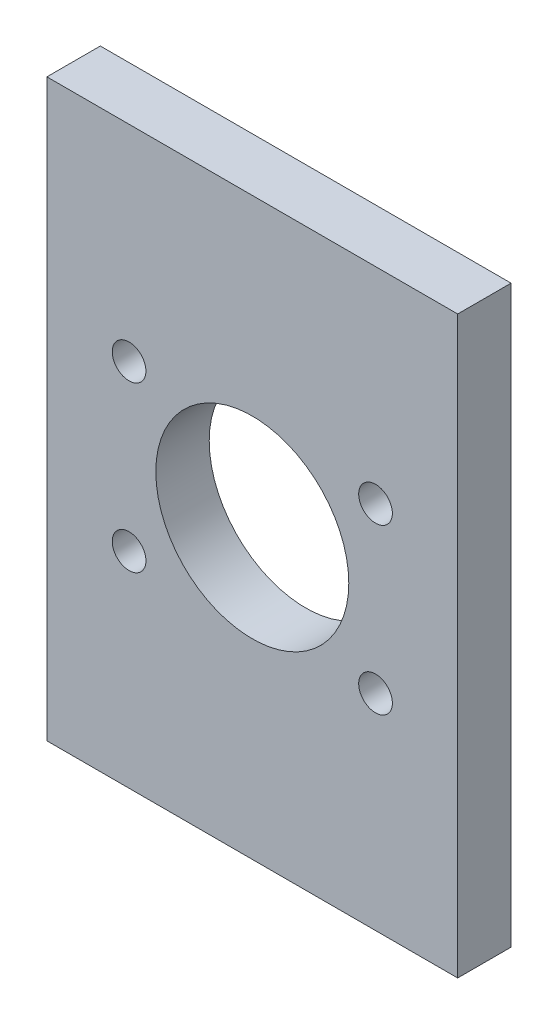
ISO-10303-21;
HEADER;
FILE_DESCRIPTION(('STEP AP214'),'2;1');
FILE_NAME('part.step','',(''),(''),'','','');
FILE_SCHEMA(('AUTOMOTIVE_DESIGN { 1 0 10303 214 1 1 1 1 }'));
ENDSEC;
DATA;
#1=APPLICATION_CONTEXT('core data for automotive mechanical design processes');
#2=APPLICATION_PROTOCOL_DEFINITION('international standard','automotive_design',2000,#1);
#3=PRODUCT_CONTEXT('',#1,'mechanical');
#4=PRODUCT('Part','Part','',(#3));
#5=PRODUCT_RELATED_PRODUCT_CATEGORY('part','',(#4));
#6=PRODUCT_DEFINITION_FORMATION('','',#4);
#7=PRODUCT_DEFINITION_CONTEXT('part definition',#1,'design');
#8=PRODUCT_DEFINITION('design','',#6,#7);
#9=PRODUCT_DEFINITION_SHAPE('','',#8);
#10=(LENGTH_UNIT() NAMED_UNIT(*) SI_UNIT(.MILLI.,.METRE.));
#11=(NAMED_UNIT(*) PLANE_ANGLE_UNIT() SI_UNIT($,.RADIAN.));
#12=(NAMED_UNIT(*) SI_UNIT($,.STERADIAN.) SOLID_ANGLE_UNIT());
#13=UNCERTAINTY_MEASURE_WITH_UNIT(LENGTH_MEASURE(1.E-05),#10,'distance_accuracy_value','');
#14=(GEOMETRIC_REPRESENTATION_CONTEXT(3) GLOBAL_UNCERTAINTY_ASSIGNED_CONTEXT((#13)) GLOBAL_UNIT_ASSIGNED_CONTEXT((#10,
#11,#12)) REPRESENTATION_CONTEXT('',''));
#15=CARTESIAN_POINT('',(0.,0.,0.));
#16=DIRECTION('',(0.,0.,1.));
#17=DIRECTION('',(1.,0.,0.));
#18=AXIS2_PLACEMENT_3D('',#15,#16,#17);
#19=CARTESIAN_POINT('',(0.,0.,13.));
#20=DIRECTION('',(0.,0.,1.));
#21=DIRECTION('',(1.,0.,0.));
#22=AXIS2_PLACEMENT_3D('',#19,#20,#21);
#23=PLANE('',#22);
#24=CARTESIAN_POINT('',(-30.,20.,13.));
#25=DIRECTION('',(0.,0.,1.));
#26=DIRECTION('',(1.,0.,0.));
#27=AXIS2_PLACEMENT_3D('',#24,#25,#26);
#28=CIRCLE('',#27,4.09999999999999);
#29=CARTESIAN_POINT('',(-25.9,20.,13.));
#30=VERTEX_POINT('',#29);
#31=EDGE_CURVE('E266',#30,#30,#28,.T.);
#32=ORIENTED_EDGE('',*,*,#31,.F.);
#33=EDGE_LOOP('',(#32));
#34=FACE_BOUND('',#33,.T.);
#35=CARTESIAN_POINT('',(30.,20.,13.));
#36=DIRECTION('',(0.,0.,1.));
#37=DIRECTION('',(1.,0.,0.));
#38=AXIS2_PLACEMENT_3D('',#35,#36,#37);
#39=CIRCLE('',#38,4.09999999999999);
#40=CARTESIAN_POINT('',(34.1,20.,13.));
#41=VERTEX_POINT('',#40);
#42=EDGE_CURVE('E124',#41,#41,#39,.T.);
#43=ORIENTED_EDGE('',*,*,#42,.F.);
#44=EDGE_LOOP('',(#43));
#45=FACE_BOUND('',#44,.T.);
#46=CARTESIAN_POINT('',(30.,-20.,13.));
#47=DIRECTION('',(0.,0.,1.));
#48=DIRECTION('',(1.,0.,0.));
#49=AXIS2_PLACEMENT_3D('',#46,#47,#48);
#50=CIRCLE('',#49,4.09999999999999);
#51=CARTESIAN_POINT('',(34.1,-20.,13.));
#52=VERTEX_POINT('',#51);
#53=EDGE_CURVE('E113',#52,#52,#50,.T.);
#54=ORIENTED_EDGE('',*,*,#53,.F.);
#55=EDGE_LOOP('',(#54));
#56=FACE_BOUND('',#55,.T.);
#57=CARTESIAN_POINT('',(-30.,-20.,13.));
#58=DIRECTION('',(0.,0.,1.));
#59=DIRECTION('',(1.,0.,0.));
#60=AXIS2_PLACEMENT_3D('',#57,#58,#59);
#61=CIRCLE('',#60,4.09999999999999);
#62=CARTESIAN_POINT('',(-25.9,-20.,13.));
#63=VERTEX_POINT('',#62);
#64=EDGE_CURVE('E112',#63,#63,#61,.T.);
#65=ORIENTED_EDGE('',*,*,#64,.F.);
#66=EDGE_LOOP('',(#65));
#67=FACE_BOUND('',#66,.T.);
#68=DIRECTION('',(0.,1.,0.));
#69=VECTOR('',#68,1.);
#70=CARTESIAN_POINT('',(50.,70.,13.));
#71=LINE('',#70,#69);
#72=CARTESIAN_POINT('',(50.,-70.,13.));
#73=VERTEX_POINT('',#72);
#74=CARTESIAN_POINT('',(50.,70.,13.));
#75=VERTEX_POINT('',#74);
#76=EDGE_CURVE('E89',#73,#75,#71,.T.);
#77=ORIENTED_EDGE('',*,*,#76,.T.);
#78=DIRECTION('',(-1.,0.,0.));
#79=VECTOR('',#78,1.);
#80=CARTESIAN_POINT('',(-50.,70.,13.));
#81=LINE('',#80,#79);
#82=CARTESIAN_POINT('',(-50.,70.,13.));
#83=VERTEX_POINT('',#82);
#84=EDGE_CURVE('E84',#75,#83,#81,.T.);
#85=ORIENTED_EDGE('',*,*,#84,.T.);
#86=DIRECTION('',(0.,-1.,0.));
#87=VECTOR('',#86,1.);
#88=CARTESIAN_POINT('',(-50.,70.,13.));
#89=LINE('',#88,#87);
#90=CARTESIAN_POINT('',(-50.,-70.,13.));
#91=VERTEX_POINT('',#90);
#92=EDGE_CURVE('E87',#83,#91,#89,.T.);
#93=ORIENTED_EDGE('',*,*,#92,.T.);
#94=DIRECTION('',(1.,0.,0.));
#95=VECTOR('',#94,1.);
#96=CARTESIAN_POINT('',(-50.,-70.,13.));
#97=LINE('',#96,#95);
#98=EDGE_CURVE('E54',#91,#73,#97,.T.);
#99=ORIENTED_EDGE('',*,*,#98,.T.);
#100=EDGE_LOOP('',(#77,#85,#93,#99));
#101=FACE_BOUND('',#100,.T.);
#102=CARTESIAN_POINT('',(0.,0.,13.));
#103=DIRECTION('',(0.,0.,1.));
#104=DIRECTION('',(1.,0.,0.));
#105=AXIS2_PLACEMENT_3D('',#102,#103,#104);
#106=CIRCLE('',#105,23.49);
#107=CARTESIAN_POINT('',(-23.49,0.,13.));
#108=VERTEX_POINT('',#107);
#109=EDGE_CURVE('E105',#108,#108,#106,.T.);
#110=ORIENTED_EDGE('',*,*,#109,.F.);
#111=EDGE_LOOP('',(#110));
#112=FACE_BOUND('',#111,.T.);
#113=ADVANCED_FACE('F35',(#34,#45,#56,#67,#101,#112),#23,.T.);
#114=CARTESIAN_POINT('',(0.,0.,0.));
#115=DIRECTION('',(0.,0.,1.));
#116=DIRECTION('',(1.,0.,0.));
#117=AXIS2_PLACEMENT_3D('',#114,#115,#116);
#118=PLANE('',#117);
#119=CARTESIAN_POINT('',(-30.,20.,0.));
#120=DIRECTION('',(0.,0.,1.));
#121=DIRECTION('',(1.,0.,0.));
#122=AXIS2_PLACEMENT_3D('',#119,#120,#121);
#123=CIRCLE('',#122,4.09999999999999);
#124=CARTESIAN_POINT('',(-25.9,20.,0.));
#125=VERTEX_POINT('',#124);
#126=EDGE_CURVE('E264',#125,#125,#123,.T.);
#127=ORIENTED_EDGE('',*,*,#126,.T.);
#128=EDGE_LOOP('',(#127));
#129=FACE_BOUND('',#128,.T.);
#130=CARTESIAN_POINT('',(30.,20.,0.));
#131=DIRECTION('',(0.,0.,1.));
#132=DIRECTION('',(1.,0.,0.));
#133=AXIS2_PLACEMENT_3D('',#130,#131,#132);
#134=CIRCLE('',#133,4.09999999999999);
#135=CARTESIAN_POINT('',(34.1,20.,0.));
#136=VERTEX_POINT('',#135);
#137=EDGE_CURVE('E39',#136,#136,#134,.T.);
#138=ORIENTED_EDGE('',*,*,#137,.T.);
#139=EDGE_LOOP('',(#138));
#140=FACE_BOUND('',#139,.T.);
#141=CARTESIAN_POINT('',(30.,-20.,0.));
#142=DIRECTION('',(0.,0.,1.));
#143=DIRECTION('',(1.,0.,0.));
#144=AXIS2_PLACEMENT_3D('',#141,#142,#143);
#145=CIRCLE('',#144,4.09999999999999);
#146=CARTESIAN_POINT('',(34.1,-20.,0.));
#147=VERTEX_POINT('',#146);
#148=EDGE_CURVE('E110',#147,#147,#145,.T.);
#149=ORIENTED_EDGE('',*,*,#148,.T.);
#150=EDGE_LOOP('',(#149));
#151=FACE_BOUND('',#150,.T.);
#152=CARTESIAN_POINT('',(-30.,-20.,0.));
#153=DIRECTION('',(0.,0.,1.));
#154=DIRECTION('',(1.,0.,0.));
#155=AXIS2_PLACEMENT_3D('',#152,#153,#154);
#156=CIRCLE('',#155,4.09999999999999);
#157=CARTESIAN_POINT('',(-25.9,-20.,0.));
#158=VERTEX_POINT('',#157);
#159=EDGE_CURVE('E117',#158,#158,#156,.T.);
#160=ORIENTED_EDGE('',*,*,#159,.T.);
#161=EDGE_LOOP('',(#160));
#162=FACE_BOUND('',#161,.T.);
#163=DIRECTION('',(0.,1.,0.));
#164=VECTOR('',#163,1.);
#165=CARTESIAN_POINT('',(50.,70.,0.));
#166=LINE('',#165,#164);
#167=CARTESIAN_POINT('',(50.,-70.,0.));
#168=VERTEX_POINT('',#167);
#169=CARTESIAN_POINT('',(50.,70.,0.));
#170=VERTEX_POINT('',#169);
#171=EDGE_CURVE('E102',#168,#170,#166,.T.);
#172=ORIENTED_EDGE('',*,*,#171,.F.);
#173=DIRECTION('',(1.,0.,0.));
#174=VECTOR('',#173,1.);
#175=CARTESIAN_POINT('',(-50.,-70.,0.));
#176=LINE('',#175,#174);
#177=CARTESIAN_POINT('',(-50.,-70.,0.));
#178=VERTEX_POINT('',#177);
#179=EDGE_CURVE('E77',#178,#168,#176,.T.);
#180=ORIENTED_EDGE('',*,*,#179,.F.);
#181=DIRECTION('',(0.,-1.,0.));
#182=VECTOR('',#181,1.);
#183=CARTESIAN_POINT('',(-50.,70.,0.));
#184=LINE('',#183,#182);
#185=CARTESIAN_POINT('',(-50.,70.,0.));
#186=VERTEX_POINT('',#185);
#187=EDGE_CURVE('E71',#186,#178,#184,.T.);
#188=ORIENTED_EDGE('',*,*,#187,.F.);
#189=DIRECTION('',(-1.,0.,0.));
#190=VECTOR('',#189,1.);
#191=CARTESIAN_POINT('',(-50.,70.,0.));
#192=LINE('',#191,#190);
#193=EDGE_CURVE('E93',#170,#186,#192,.T.);
#194=ORIENTED_EDGE('',*,*,#193,.F.);
#195=EDGE_LOOP('',(#172,#180,#188,#194));
#196=FACE_BOUND('',#195,.T.);
#197=CARTESIAN_POINT('',(0.,0.,0.));
#198=DIRECTION('',(0.,0.,1.));
#199=DIRECTION('',(1.,0.,0.));
#200=AXIS2_PLACEMENT_3D('',#197,#198,#199);
#201=CIRCLE('',#200,23.49);
#202=CARTESIAN_POINT('',(-23.49,0.,0.));
#203=VERTEX_POINT('',#202);
#204=EDGE_CURVE('E130',#203,#203,#201,.T.);
#205=ORIENTED_EDGE('',*,*,#204,.T.);
#206=EDGE_LOOP('',(#205));
#207=FACE_BOUND('',#206,.T.);
#208=ADVANCED_FACE('F140',(#129,#140,#151,#162,#196,#207),#118,.F.);
#209=CARTESIAN_POINT('',(50.,70.,13.));
#210=DIRECTION('',(-1.,0.,0.));
#211=DIRECTION('',(0.,-1.,0.));
#212=AXIS2_PLACEMENT_3D('',#209,#210,#211);
#213=PLANE('',#212);
#214=ORIENTED_EDGE('',*,*,#171,.T.);
#215=DIRECTION('',(0.,0.,-1.));
#216=VECTOR('',#215,1.);
#217=CARTESIAN_POINT('',(50.,70.,13.));
#218=LINE('',#217,#216);
#219=EDGE_CURVE('E11',#75,#170,#218,.T.);
#220=ORIENTED_EDGE('',*,*,#219,.F.);
#221=ORIENTED_EDGE('',*,*,#76,.F.);
#222=DIRECTION('',(0.,0.,-1.));
#223=VECTOR('',#222,1.);
#224=CARTESIAN_POINT('',(50.,-70.,13.));
#225=LINE('',#224,#223);
#226=EDGE_CURVE('E98',#73,#168,#225,.T.);
#227=ORIENTED_EDGE('',*,*,#226,.T.);
#228=EDGE_LOOP('',(#214,#220,#221,#227));
#229=FACE_BOUND('',#228,.T.);
#230=ADVANCED_FACE('F37',(#229),#213,.F.);
#231=CARTESIAN_POINT('',(-50.,70.,13.));
#232=DIRECTION('',(0.,-1.,0.));
#233=DIRECTION('',(0.,0.,-1.));
#234=AXIS2_PLACEMENT_3D('',#231,#232,#233);
#235=PLANE('',#234);
#236=ORIENTED_EDGE('',*,*,#193,.T.);
#237=DIRECTION('',(0.,0.,-1.));
#238=VECTOR('',#237,1.);
#239=CARTESIAN_POINT('',(-50.,70.,13.));
#240=LINE('',#239,#238);
#241=EDGE_CURVE('E45',#83,#186,#240,.T.);
#242=ORIENTED_EDGE('',*,*,#241,.F.);
#243=ORIENTED_EDGE('',*,*,#84,.F.);
#244=ORIENTED_EDGE('',*,*,#219,.T.);
#245=EDGE_LOOP('',(#236,#242,#243,#244));
#246=FACE_BOUND('',#245,.T.);
#247=ADVANCED_FACE('F92',(#246),#235,.F.);
#248=CARTESIAN_POINT('',(-50.,70.,13.));
#249=DIRECTION('',(1.,0.,0.));
#250=DIRECTION('',(0.,1.,0.));
#251=AXIS2_PLACEMENT_3D('',#248,#249,#250);
#252=PLANE('',#251);
#253=ORIENTED_EDGE('',*,*,#187,.T.);
#254=DIRECTION('',(0.,0.,-1.));
#255=VECTOR('',#254,1.);
#256=CARTESIAN_POINT('',(-50.,-70.,13.));
#257=LINE('',#256,#255);
#258=EDGE_CURVE('E94',#91,#178,#257,.T.);
#259=ORIENTED_EDGE('',*,*,#258,.F.);
#260=ORIENTED_EDGE('',*,*,#92,.F.);
#261=ORIENTED_EDGE('',*,*,#241,.T.);
#262=EDGE_LOOP('',(#253,#259,#260,#261));
#263=FACE_BOUND('',#262,.T.);
#264=ADVANCED_FACE('F96',(#263),#252,.F.);
#265=CARTESIAN_POINT('',(-50.,-70.,13.));
#266=DIRECTION('',(0.,1.,0.));
#267=DIRECTION('',(0.,0.,1.));
#268=AXIS2_PLACEMENT_3D('',#265,#266,#267);
#269=PLANE('',#268);
#270=ORIENTED_EDGE('',*,*,#179,.T.);
#271=ORIENTED_EDGE('',*,*,#226,.F.);
#272=ORIENTED_EDGE('',*,*,#98,.F.);
#273=ORIENTED_EDGE('',*,*,#258,.T.);
#274=EDGE_LOOP('',(#270,#271,#272,#273));
#275=FACE_BOUND('',#274,.T.);
#276=ADVANCED_FACE('F145',(#275),#269,.F.);
#277=CARTESIAN_POINT('',(0.,0.,13.));
#278=DIRECTION('',(0.,0.,-1.));
#279=DIRECTION('',(-1.,0.,0.));
#280=AXIS2_PLACEMENT_3D('',#277,#278,#279);
#281=CYLINDRICAL_SURFACE('',#280,23.49);
#282=CARTESIAN_POINT('',(-23.49,0.,13.));
#283=CARTESIAN_POINT('',(-23.49,0.,12.8645833333333));
#284=CARTESIAN_POINT('',(-23.49,0.,12.7291666666667));
#285=CARTESIAN_POINT('',(-23.49,0.,12.4583333333333));
#286=CARTESIAN_POINT('',(-23.49,0.,12.3229166666667));
#287=CARTESIAN_POINT('',(-23.49,0.,12.0520833333333));
#288=CARTESIAN_POINT('',(-23.49,0.,11.9166666666667));
#289=CARTESIAN_POINT('',(-23.49,0.,11.6458333333333));
#290=CARTESIAN_POINT('',(-23.49,0.,11.5104166666667));
#291=CARTESIAN_POINT('',(-23.49,0.,11.2395833333333));
#292=CARTESIAN_POINT('',(-23.49,0.,11.1041666666667));
#293=CARTESIAN_POINT('',(-23.49,0.,10.8333333333333));
#294=CARTESIAN_POINT('',(-23.49,0.,10.6979166666667));
#295=CARTESIAN_POINT('',(-23.49,0.,10.4270833333333));
#296=CARTESIAN_POINT('',(-23.49,0.,10.2916666666667));
#297=CARTESIAN_POINT('',(-23.49,0.,10.0208333333333));
#298=CARTESIAN_POINT('',(-23.49,0.,9.88541666666667));
#299=CARTESIAN_POINT('',(-23.49,0.,9.61458333333333));
#300=CARTESIAN_POINT('',(-23.49,0.,9.47916666666667));
#301=CARTESIAN_POINT('',(-23.49,0.,9.20833333333333));
#302=CARTESIAN_POINT('',(-23.49,0.,9.07291666666666));
#303=CARTESIAN_POINT('',(-23.49,0.,8.80208333333333));
#304=CARTESIAN_POINT('',(-23.49,0.,8.66666666666667));
#305=CARTESIAN_POINT('',(-23.49,0.,8.39583333333333));
#306=CARTESIAN_POINT('',(-23.49,0.,8.26041666666667));
#307=CARTESIAN_POINT('',(-23.49,0.,7.98958333333333));
#308=CARTESIAN_POINT('',(-23.49,0.,7.85416666666667));
#309=CARTESIAN_POINT('',(-23.49,0.,7.58333333333333));
#310=CARTESIAN_POINT('',(-23.49,0.,7.44791666666667));
#311=CARTESIAN_POINT('',(-23.49,0.,7.17708333333333));
#312=CARTESIAN_POINT('',(-23.49,0.,7.04166666666667));
#313=CARTESIAN_POINT('',(-23.49,0.,6.77083333333333));
#314=CARTESIAN_POINT('',(-23.49,0.,6.63541666666667));
#315=CARTESIAN_POINT('',(-23.49,0.,6.36458333333333));
#316=CARTESIAN_POINT('',(-23.49,0.,6.22916666666667));
#317=CARTESIAN_POINT('',(-23.49,0.,5.95833333333333));
#318=CARTESIAN_POINT('',(-23.49,0.,5.82291666666667));
#319=CARTESIAN_POINT('',(-23.49,0.,5.55208333333333));
#320=CARTESIAN_POINT('',(-23.49,0.,5.41666666666667));
#321=CARTESIAN_POINT('',(-23.49,0.,5.14583333333333));
#322=CARTESIAN_POINT('',(-23.49,0.,5.01041666666667));
#323=CARTESIAN_POINT('',(-23.49,0.,4.73958333333333));
#324=CARTESIAN_POINT('',(-23.49,0.,4.60416666666667));
#325=CARTESIAN_POINT('',(-23.49,0.,4.33333333333333));
#326=CARTESIAN_POINT('',(-23.49,0.,4.19791666666667));
#327=CARTESIAN_POINT('',(-23.49,0.,3.92708333333333));
#328=CARTESIAN_POINT('',(-23.49,0.,3.79166666666667));
#329=CARTESIAN_POINT('',(-23.49,0.,3.52083333333333));
#330=CARTESIAN_POINT('',(-23.49,0.,3.38541666666667));
#331=CARTESIAN_POINT('',(-23.49,0.,3.11458333333333));
#332=CARTESIAN_POINT('',(-23.49,0.,2.97916666666667));
#333=CARTESIAN_POINT('',(-23.49,0.,2.70833333333333));
#334=CARTESIAN_POINT('',(-23.49,0.,2.57291666666667));
#335=CARTESIAN_POINT('',(-23.49,0.,2.30208333333333));
#336=CARTESIAN_POINT('',(-23.49,0.,2.16666666666667));
#337=CARTESIAN_POINT('',(-23.49,0.,1.89583333333333));
#338=CARTESIAN_POINT('',(-23.49,0.,1.76041666666667));
#339=CARTESIAN_POINT('',(-23.49,0.,1.48958333333333));
#340=CARTESIAN_POINT('',(-23.49,0.,1.35416666666667));
#341=CARTESIAN_POINT('',(-23.49,0.,1.08333333333333));
#342=CARTESIAN_POINT('',(-23.49,0.,0.947916666666667));
#343=CARTESIAN_POINT('',(-23.49,0.,0.677083333333334));
#344=CARTESIAN_POINT('',(-23.49,0.,0.541666666666667));
#345=CARTESIAN_POINT('',(-23.49,0.,0.270833333333334));
#346=CARTESIAN_POINT('',(-23.49,0.,0.135416666666667));
#347=CARTESIAN_POINT('',(-23.49,0.,0.));
#348=B_SPLINE_CURVE_WITH_KNOTS('',3,(#282,#283,#284,#285,#286,#287,#288,#289,#290,#291,#292,
#293,#294,#295,#296,#297,#298,#299,#300,#301,#302,#303,#304,#305,#306,#307,#308,#309,#310,#311,
#312,#313,#314,#315,#316,#317,#318,#319,#320,#321,#322,#323,#324,#325,#326,#327,#328,#329,#330,
#331,#332,#333,#334,#335,#336,#337,#338,#339,#340,#341,#342,#343,#344,#345,#346,#347),
.UNSPECIFIED.,.F.,.F.,(4,2,2,2,2,2,2,2,2,2,2,2,2,2,2,2,2,2,2,2,2,2,2,2,2,2,2,2,2,2,2,2,4),(0.,
0.40625,0.812500000000001,1.21875,1.625,2.03125,2.4375,2.84375,3.25,3.65625,4.0625,4.46875,
4.875,5.28125,5.6875,6.09375,6.5,6.90625,7.3125,7.71875,8.125,8.53125,8.9375,9.34375,9.75,
10.15625,10.5625,10.96875,11.375,11.78125,12.1875,12.59375,13.),.UNSPECIFIED.);
#349=EDGE_CURVE('BSEAM142',#108,#203,#348,.T.);
#350=ORIENTED_EDGE('',*,*,#109,.T.);
#351=ORIENTED_EDGE('',*,*,#204,.F.);
#352=ORIENTED_EDGE('',*,*,#349,.T.);
#353=ORIENTED_EDGE('',*,*,#349,.F.);
#354=EDGE_LOOP('',(#350,#352,#351,#353));
#355=FACE_BOUND('',#354,.T.);
#356=ADVANCED_FACE('F142',(#355),#281,.F.);
#357=CARTESIAN_POINT('',(-30.,-20.,13.));
#358=DIRECTION('',(0.,0.,1.));
#359=DIRECTION('',(1.,0.,0.));
#360=AXIS2_PLACEMENT_3D('',#357,#358,#359);
#361=CYLINDRICAL_SURFACE('',#360,4.09999999999999);
#362=ORIENTED_EDGE('',*,*,#64,.T.);
#363=EDGE_LOOP('',(#362));
#364=FACE_BOUND('',#363,.T.);
#365=ORIENTED_EDGE('',*,*,#159,.F.);
#366=EDGE_LOOP('',(#365));
#367=FACE_BOUND('',#366,.T.);
#368=ADVANCED_FACE('F144',(#364,#367),#361,.F.);
#369=CARTESIAN_POINT('',(30.,-20.,13.));
#370=DIRECTION('',(0.,0.,1.));
#371=DIRECTION('',(1.,0.,0.));
#372=AXIS2_PLACEMENT_3D('',#369,#370,#371);
#373=CYLINDRICAL_SURFACE('',#372,4.09999999999999);
#374=ORIENTED_EDGE('',*,*,#53,.T.);
#375=EDGE_LOOP('',(#374));
#376=FACE_BOUND('',#375,.T.);
#377=ORIENTED_EDGE('',*,*,#148,.F.);
#378=EDGE_LOOP('',(#377));
#379=FACE_BOUND('',#378,.T.);
#380=ADVANCED_FACE('F152',(#376,#379),#373,.F.);
#381=CARTESIAN_POINT('',(30.,20.,13.));
#382=DIRECTION('',(0.,0.,1.));
#383=DIRECTION('',(1.,0.,0.));
#384=AXIS2_PLACEMENT_3D('',#381,#382,#383);
#385=CYLINDRICAL_SURFACE('',#384,4.09999999999999);
#386=ORIENTED_EDGE('',*,*,#42,.T.);
#387=EDGE_LOOP('',(#386));
#388=FACE_BOUND('',#387,.T.);
#389=ORIENTED_EDGE('',*,*,#137,.F.);
#390=EDGE_LOOP('',(#389));
#391=FACE_BOUND('',#390,.T.);
#392=ADVANCED_FACE('F191',(#388,#391),#385,.F.);
#393=CARTESIAN_POINT('',(-30.,20.,13.));
#394=DIRECTION('',(0.,0.,1.));
#395=DIRECTION('',(1.,0.,0.));
#396=AXIS2_PLACEMENT_3D('',#393,#394,#395);
#397=CYLINDRICAL_SURFACE('',#396,4.09999999999999);
#398=ORIENTED_EDGE('',*,*,#31,.T.);
#399=EDGE_LOOP('',(#398));
#400=FACE_BOUND('',#399,.T.);
#401=ORIENTED_EDGE('',*,*,#126,.F.);
#402=EDGE_LOOP('',(#401));
#403=FACE_BOUND('',#402,.T.);
#404=ADVANCED_FACE('F187',(#400,#403),#397,.F.);
#405=CLOSED_SHELL('',(#113,#208,#230,#247,#264,#276,#356,#368,#380,#392,#404));
#406=MANIFOLD_SOLID_BREP('B2',#405);
#407=ADVANCED_BREP_SHAPE_REPRESENTATION('',(#18,#406),#14);
#408=SHAPE_DEFINITION_REPRESENTATION(#9,#407);
ENDSEC;
END-ISO-10303-21;
